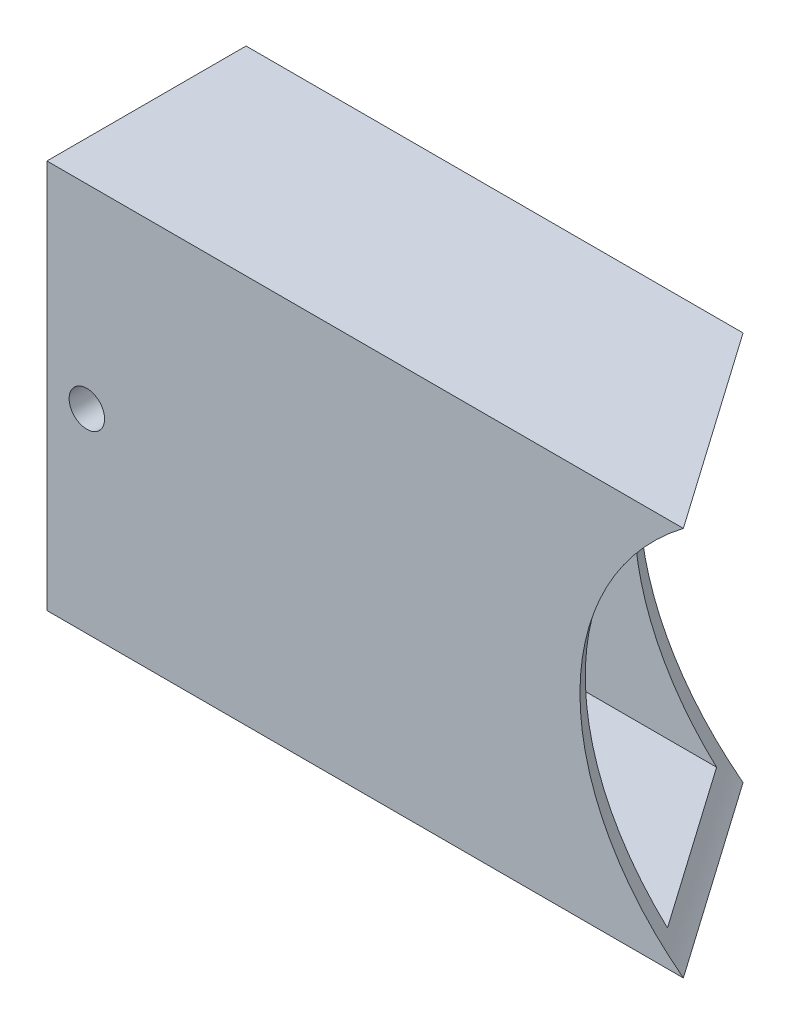
ISO-10303-21;
HEADER;
FILE_DESCRIPTION(('STEP AP214'),'2;1');
FILE_NAME('part.step','',(''),(''),'','','');
FILE_SCHEMA(('AUTOMOTIVE_DESIGN { 1 0 10303 214 1 1 1 1 }'));
ENDSEC;
DATA;
#1=APPLICATION_CONTEXT('core data for automotive mechanical design processes');
#2=APPLICATION_PROTOCOL_DEFINITION('international standard','automotive_design',2000,#1);
#3=PRODUCT_CONTEXT('',#1,'mechanical');
#4=PRODUCT('Part','Part','',(#3));
#5=PRODUCT_RELATED_PRODUCT_CATEGORY('part','',(#4));
#6=PRODUCT_DEFINITION_FORMATION('','',#4);
#7=PRODUCT_DEFINITION_CONTEXT('part definition',#1,'design');
#8=PRODUCT_DEFINITION('design','',#6,#7);
#9=PRODUCT_DEFINITION_SHAPE('','',#8);
#10=(LENGTH_UNIT() NAMED_UNIT(*) SI_UNIT(.MILLI.,.METRE.));
#11=(NAMED_UNIT(*) PLANE_ANGLE_UNIT() SI_UNIT($,.RADIAN.));
#12=(NAMED_UNIT(*) SI_UNIT($,.STERADIAN.) SOLID_ANGLE_UNIT());
#13=UNCERTAINTY_MEASURE_WITH_UNIT(LENGTH_MEASURE(1.E-05),#10,'distance_accuracy_value','');
#14=(GEOMETRIC_REPRESENTATION_CONTEXT(3) GLOBAL_UNCERTAINTY_ASSIGNED_CONTEXT((#13)) GLOBAL_UNIT_ASSIGNED_CONTEXT((#10,
#11,#12)) REPRESENTATION_CONTEXT('',''));
#15=CARTESIAN_POINT('',(0.,0.,0.));
#16=DIRECTION('',(0.,0.,1.));
#17=DIRECTION('',(1.,0.,0.));
#18=AXIS2_PLACEMENT_3D('',#15,#16,#17);
#19=CARTESIAN_POINT('',(-27.,40.2743309975562,0.638657409584718));
#20=DIRECTION('',(0.,1.,0.));
#21=DIRECTION('',(0.,0.,1.));
#22=AXIS2_PLACEMENT_3D('',#19,#20,#21);
#23=PLANE('',#22);
#24=DIRECTION('',(0.573576436351041,0.,0.819152044288995));
#25=VECTOR('',#24,1.);
#26=CARTESIAN_POINT('',(63.1023728158104,40.2743309975562,26.8401633076312));
#27=LINE('',#26,#25);
#28=CARTESIAN_POINT('',(29.0362216407446,40.2743309975562,-21.8113425904153));
#29=VERTEX_POINT('',#28);
#30=CARTESIAN_POINT('',(44.7558808735523,40.2743309975562,0.638657409584718));
#31=VERTEX_POINT('',#30);
#32=EDGE_CURVE('E55',#29,#31,#27,.T.);
#33=ORIENTED_EDGE('',*,*,#32,.F.);
#34=DIRECTION('',(1.,0.,0.));
#35=VECTOR('',#34,1.);
#36=CARTESIAN_POINT('',(-27.,40.2743309975562,-21.8113425904153));
#37=LINE('',#36,#35);
#38=CARTESIAN_POINT('',(-27.,40.2743309975562,-21.8113425904153));
#39=VERTEX_POINT('',#38);
#40=EDGE_CURVE('E210',#39,#29,#37,.T.);
#41=ORIENTED_EDGE('',*,*,#40,.F.);
#42=DIRECTION('',(0.,0.,1.));
#43=VECTOR('',#42,1.);
#44=CARTESIAN_POINT('',(-27.,40.2743309975562,0.638657409584718));
#45=LINE('',#44,#43);
#46=CARTESIAN_POINT('',(-27.,40.2743309975562,0.638657409584718));
#47=VERTEX_POINT('',#46);
#48=EDGE_CURVE('E190',#39,#47,#45,.T.);
#49=ORIENTED_EDGE('',*,*,#48,.T.);
#50=DIRECTION('',(1.,0.,0.));
#51=VECTOR('',#50,1.);
#52=CARTESIAN_POINT('',(-27.,40.2743309975562,0.638657409584718));
#53=LINE('',#52,#51);
#54=EDGE_CURVE('E209',#47,#31,#53,.T.);
#55=ORIENTED_EDGE('',*,*,#54,.T.);
#56=EDGE_LOOP('',(#33,#41,#49,#55));
#57=FACE_BOUND('',#56,.T.);
#58=ADVANCED_FACE('F33',(#57),#23,.T.);
#59=CARTESIAN_POINT('',(-27.,40.2743309975562,-21.8113425904153));
#60=DIRECTION('',(0.,0.,-1.));
#61=DIRECTION('',(-1.,0.,0.));
#62=AXIS2_PLACEMENT_3D('',#59,#60,#61);
#63=PLANE('',#62);
#64=CARTESIAN_POINT('',(54.0009127415229,18.3243309975562,-21.8113425904153));
#65=DIRECTION('',(0.,0.,-1.));
#66=DIRECTION('',(1.,0.,0.));
#67=AXIS2_PLACEMENT_3D('',#64,#65,#66);
#68=ELLIPSE('',#67,36.6232376628435,30.);
#69=CARTESIAN_POINT('',(29.0362216407446,-3.62566900244382,-21.8113425904153));
#70=VERTEX_POINT('',#69);
#71=EDGE_CURVE('E171',#70,#29,#68,.T.);
#72=ORIENTED_EDGE('',*,*,#71,.F.);
#73=DIRECTION('',(1.,0.,0.));
#74=VECTOR('',#73,1.);
#75=CARTESIAN_POINT('',(-27.,-3.62566900244382,-21.8113425904153));
#76=LINE('',#75,#74);
#77=CARTESIAN_POINT('',(-27.,-3.62566900244382,-21.8113425904153));
#78=VERTEX_POINT('',#77);
#79=EDGE_CURVE('E214',#78,#70,#76,.T.);
#80=ORIENTED_EDGE('',*,*,#79,.F.);
#81=DIRECTION('',(0.,1.,0.));
#82=VECTOR('',#81,1.);
#83=CARTESIAN_POINT('',(-27.,40.2743309975562,-21.8113425904153));
#84=LINE('',#83,#82);
#85=EDGE_CURVE('E206',#78,#39,#84,.T.);
#86=ORIENTED_EDGE('',*,*,#85,.T.);
#87=ORIENTED_EDGE('',*,*,#40,.T.);
#88=EDGE_LOOP('',(#72,#80,#86,#87));
#89=FACE_BOUND('',#88,.T.);
#90=ADVANCED_FACE('F244',(#89),#63,.T.);
#91=CARTESIAN_POINT('',(-27.,-3.62566900244382,0.638657409584711));
#92=DIRECTION('',(0.,-1.,0.));
#93=DIRECTION('',(0.,0.,-1.));
#94=AXIS2_PLACEMENT_3D('',#91,#92,#93);
#95=PLANE('',#94);
#96=DIRECTION('',(0.573576436351041,0.,0.819152044288995));
#97=VECTOR('',#96,1.);
#98=CARTESIAN_POINT('',(63.1023728158104,-3.62566900244382,26.8401633076313));
#99=LINE('',#98,#97);
#100=CARTESIAN_POINT('',(44.7558808735523,-3.62566900244382,0.638657409584711));
#101=VERTEX_POINT('',#100);
#102=EDGE_CURVE('E169',#101,#70,#99,.F.);
#103=ORIENTED_EDGE('',*,*,#102,.F.);
#104=DIRECTION('',(1.,0.,0.));
#105=VECTOR('',#104,1.);
#106=CARTESIAN_POINT('',(-27.,-3.62566900244382,0.638657409584711));
#107=LINE('',#106,#105);
#108=CARTESIAN_POINT('',(-27.,-3.62566900244382,0.638657409584711));
#109=VERTEX_POINT('',#108);
#110=EDGE_CURVE('E217',#109,#101,#107,.T.);
#111=ORIENTED_EDGE('',*,*,#110,.F.);
#112=DIRECTION('',(0.,0.,-1.));
#113=VECTOR('',#112,1.);
#114=CARTESIAN_POINT('',(-27.,-3.62566900244382,0.638657409584711));
#115=LINE('',#114,#113);
#116=EDGE_CURVE('E203',#109,#78,#115,.T.);
#117=ORIENTED_EDGE('',*,*,#116,.T.);
#118=ORIENTED_EDGE('',*,*,#79,.T.);
#119=EDGE_LOOP('',(#103,#111,#117,#118));
#120=FACE_BOUND('',#119,.T.);
#121=ADVANCED_FACE('F249',(#120),#95,.T.);
#122=CARTESIAN_POINT('',(-27.,40.2743309975562,0.638657409584718));
#123=DIRECTION('',(0.,0.,1.));
#124=DIRECTION('',(0.,-1.,0.));
#125=AXIS2_PLACEMENT_3D('',#122,#123,#124);
#126=PLANE('',#125);
#127=CARTESIAN_POINT('',(-22.5,18.3243309975562,0.638657409584711));
#128=DIRECTION('',(0.,0.,1.));
#129=DIRECTION('',(1.,0.,0.));
#130=AXIS2_PLACEMENT_3D('',#127,#128,#129);
#131=CIRCLE('',#130,2.);
#132=CARTESIAN_POINT('',(-20.5,18.3243309975562,0.638657409584711));
#133=VERTEX_POINT('',#132);
#134=EDGE_CURVE('E147',#133,#133,#131,.T.);
#135=ORIENTED_EDGE('',*,*,#134,.F.);
#136=EDGE_LOOP('',(#135));
#137=FACE_BOUND('',#136,.T.);
#138=DIRECTION('',(0.,-1.,0.));
#139=VECTOR('',#138,1.);
#140=CARTESIAN_POINT('',(-27.,40.2743309975562,0.638657409584718));
#141=LINE('',#140,#139);
#142=EDGE_CURVE('E201',#47,#109,#141,.T.);
#143=ORIENTED_EDGE('',*,*,#142,.T.);
#144=ORIENTED_EDGE('',*,*,#110,.T.);
#145=CARTESIAN_POINT('',(69.7205719743306,18.3243309975562,0.638657409584714));
#146=DIRECTION('',(0.,0.,1.));
#147=DIRECTION('',(1.,0.,0.));
#148=AXIS2_PLACEMENT_3D('',#145,#146,#147);
#149=ELLIPSE('',#148,36.6232376628435,30.);
#150=EDGE_CURVE('E167',#31,#101,#149,.T.);
#151=ORIENTED_EDGE('',*,*,#150,.F.);
#152=ORIENTED_EDGE('',*,*,#54,.F.);
#153=EDGE_LOOP('',(#143,#144,#151,#152));
#154=FACE_BOUND('',#153,.T.);
#155=ADVANCED_FACE('F259',(#137,#154),#126,.T.);
#156=CARTESIAN_POINT('',(-27.,0.,0.));
#157=DIRECTION('',(-1.,0.,0.));
#158=DIRECTION('',(0.,0.,1.));
#159=AXIS2_PLACEMENT_3D('',#156,#157,#158);
#160=PLANE('',#159);
#161=DIRECTION('',(0.,-1.,0.));
#162=VECTOR('',#161,1.);
#163=CARTESIAN_POINT('',(-27.,38.2743309975562,-1.36134259041528));
#164=LINE('',#163,#162);
#165=CARTESIAN_POINT('',(-27.,38.2743309975562,-1.36134259041528));
#166=VERTEX_POINT('',#165);
#167=CARTESIAN_POINT('',(-27.,22.8532950162725,-1.36134259041528));
#168=VERTEX_POINT('',#167);
#169=EDGE_CURVE('E175',#166,#168,#164,.T.);
#170=ORIENTED_EDGE('',*,*,#169,.T.);
#171=DIRECTION('',(0.,0.,1.));
#172=VECTOR('',#171,1.);
#173=CARTESIAN_POINT('',(-27.,22.8532950162725,-5.36134259041529));
#174=LINE('',#173,#172);
#175=CARTESIAN_POINT('',(-27.,22.8532950162725,-5.36134259041529));
#176=VERTEX_POINT('',#175);
#177=EDGE_CURVE('E143',#176,#168,#174,.T.);
#178=ORIENTED_EDGE('',*,*,#177,.F.);
#179=DIRECTION('',(0.,-1.,0.));
#180=VECTOR('',#179,1.);
#181=CARTESIAN_POINT('',(-27.,22.8532950162725,-5.36134259041529));
#182=LINE('',#181,#180);
#183=CARTESIAN_POINT('',(-27.,13.7953669788399,-5.36134259041529));
#184=VERTEX_POINT('',#183);
#185=EDGE_CURVE('E135',#176,#184,#182,.T.);
#186=ORIENTED_EDGE('',*,*,#185,.T.);
#187=DIRECTION('',(0.,0.,1.));
#188=VECTOR('',#187,1.);
#189=CARTESIAN_POINT('',(-27.,13.7953669788399,-5.36134259041529));
#190=LINE('',#189,#188);
#191=CARTESIAN_POINT('',(-27.,13.7953669788399,-1.36134259041529));
#192=VERTEX_POINT('',#191);
#193=EDGE_CURVE('E119',#184,#192,#190,.T.);
#194=ORIENTED_EDGE('',*,*,#193,.T.);
#195=CARTESIAN_POINT('',(-27.,-1.62566900244382,-1.36134259041529));
#196=VERTEX_POINT('',#195);
#197=EDGE_CURVE('E174',#192,#196,#164,.T.);
#198=ORIENTED_EDGE('',*,*,#197,.T.);
#199=DIRECTION('',(0.,0.,-1.));
#200=VECTOR('',#199,1.);
#201=CARTESIAN_POINT('',(-27.,-1.62566900244382,-1.36134259041529));
#202=LINE('',#201,#200);
#203=CARTESIAN_POINT('',(-27.,-1.62566900244382,-19.8113425904153));
#204=VERTEX_POINT('',#203);
#205=EDGE_CURVE('E177',#196,#204,#202,.T.);
#206=ORIENTED_EDGE('',*,*,#205,.T.);
#207=DIRECTION('',(0.,1.,0.));
#208=VECTOR('',#207,1.);
#209=CARTESIAN_POINT('',(-27.,38.2743309975562,-19.8113425904153));
#210=LINE('',#209,#208);
#211=CARTESIAN_POINT('',(-27.,38.2743309975562,-19.8113425904153));
#212=VERTEX_POINT('',#211);
#213=EDGE_CURVE('E180',#204,#212,#210,.T.);
#214=ORIENTED_EDGE('',*,*,#213,.T.);
#215=DIRECTION('',(0.,0.,1.));
#216=VECTOR('',#215,1.);
#217=CARTESIAN_POINT('',(-27.,38.2743309975562,-1.36134259041528));
#218=LINE('',#217,#216);
#219=EDGE_CURVE('E183',#212,#166,#218,.T.);
#220=ORIENTED_EDGE('',*,*,#219,.T.);
#221=EDGE_LOOP('',(#170,#178,#186,#194,#198,#206,#214,#220));
#222=FACE_BOUND('',#221,.T.);
#223=ORIENTED_EDGE('',*,*,#116,.F.);
#224=ORIENTED_EDGE('',*,*,#142,.F.);
#225=ORIENTED_EDGE('',*,*,#48,.F.);
#226=ORIENTED_EDGE('',*,*,#85,.F.);
#227=EDGE_LOOP('',(#223,#224,#225,#226));
#228=FACE_BOUND('',#227,.T.);
#229=ADVANCED_FACE('F141',(#222,#228),#160,.T.);
#230=CARTESIAN_POINT('',(-27.,38.2743309975562,-1.36134259041528));
#231=DIRECTION('',(0.,0.,1.));
#232=DIRECTION('',(0.,-1.,0.));
#233=AXIS2_PLACEMENT_3D('',#230,#231,#232);
#234=PLANE('',#233);
#235=DIRECTION('',(0.,1.,0.));
#236=VECTOR('',#235,1.);
#237=CARTESIAN_POINT('',(-17.3022461673715,38.2743309975562,-1.36134259041528));
#238=LINE('',#237,#236);
#239=CARTESIAN_POINT('',(-17.3022461673715,13.7953669788399,-1.36134259041529));
#240=VERTEX_POINT('',#239);
#241=CARTESIAN_POINT('',(-17.3022461673715,22.8532950162725,-1.36134259041529));
#242=VERTEX_POINT('',#241);
#243=EDGE_CURVE('E40',#240,#242,#238,.T.);
#244=ORIENTED_EDGE('',*,*,#243,.T.);
#245=DIRECTION('',(-1.,0.,0.));
#246=VECTOR('',#245,1.);
#247=CARTESIAN_POINT('',(-27.,22.8532950162725,-1.36134259041529));
#248=LINE('',#247,#246);
#249=EDGE_CURVE('E11',#242,#168,#248,.T.);
#250=ORIENTED_EDGE('',*,*,#249,.T.);
#251=ORIENTED_EDGE('',*,*,#169,.F.);
#252=DIRECTION('',(1.,0.,0.));
#253=VECTOR('',#252,1.);
#254=CARTESIAN_POINT('',(-27.,38.2743309975562,-1.36134259041528));
#255=LINE('',#254,#253);
#256=CARTESIAN_POINT('',(40.9683351350106,38.2743309975562,-1.36134259041528));
#257=VERTEX_POINT('',#256);
#258=EDGE_CURVE('E187',#166,#257,#255,.T.);
#259=ORIENTED_EDGE('',*,*,#258,.T.);
#260=CARTESIAN_POINT('',(68.3201568979112,18.3243309975562,-1.36134259041529));
#261=DIRECTION('',(0.,0.,1.));
#262=DIRECTION('',(1.,0.,0.));
#263=AXIS2_PLACEMENT_3D('',#260,#261,#262);
#264=ELLIPSE('',#263,36.6232376628435,30.);
#265=CARTESIAN_POINT('',(40.9683351350106,-1.62566900244382,-1.36134259041528));
#266=VERTEX_POINT('',#265);
#267=EDGE_CURVE('E164',#257,#266,#264,.T.);
#268=ORIENTED_EDGE('',*,*,#267,.T.);
#269=DIRECTION('',(1.,0.,0.));
#270=VECTOR('',#269,1.);
#271=CARTESIAN_POINT('',(-27.,-1.62566900244382,-1.36134259041529));
#272=LINE('',#271,#270);
#273=EDGE_CURVE('E186',#196,#266,#272,.T.);
#274=ORIENTED_EDGE('',*,*,#273,.F.);
#275=ORIENTED_EDGE('',*,*,#197,.F.);
#276=DIRECTION('',(1.,0.,0.));
#277=VECTOR('',#276,1.);
#278=CARTESIAN_POINT('',(-27.,13.7953669788399,-1.36134259041529));
#279=LINE('',#278,#277);
#280=EDGE_CURVE('E124',#192,#240,#279,.T.);
#281=ORIENTED_EDGE('',*,*,#280,.T.);
#282=EDGE_LOOP('',(#244,#250,#251,#259,#268,#274,#275,#281));
#283=FACE_BOUND('',#282,.T.);
#284=ADVANCED_FACE('F226',(#283),#234,.F.);
#285=CARTESIAN_POINT('',(-27.,38.2743309975562,-1.36134259041528));
#286=DIRECTION('',(0.,1.,0.));
#287=DIRECTION('',(0.,0.,1.));
#288=AXIS2_PLACEMENT_3D('',#285,#286,#287);
#289=PLANE('',#288);
#290=DIRECTION('',(1.,0.,0.));
#291=VECTOR('',#290,1.);
#292=CARTESIAN_POINT('',(-27.,38.2743309975562,-19.8113425904153));
#293=LINE('',#292,#291);
#294=CARTESIAN_POINT('',(28.0495060550417,38.2743309975562,-19.8113425904153));
#295=VERTEX_POINT('',#294);
#296=EDGE_CURVE('E191',#212,#295,#293,.T.);
#297=ORIENTED_EDGE('',*,*,#296,.T.);
#298=DIRECTION('',(0.573576436351041,0.,0.819152044288995));
#299=VECTOR('',#298,1.);
#300=CARTESIAN_POINT('',(61.5005840991512,38.2743309975562,27.9617478416553));
#301=LINE('',#300,#299);
#302=EDGE_CURVE('E161',#295,#257,#301,.T.);
#303=ORIENTED_EDGE('',*,*,#302,.T.);
#304=ORIENTED_EDGE('',*,*,#258,.F.);
#305=ORIENTED_EDGE('',*,*,#219,.F.);
#306=EDGE_LOOP('',(#297,#303,#304,#305));
#307=FACE_BOUND('',#306,.T.);
#308=ADVANCED_FACE('F268',(#307),#289,.F.);
#309=CARTESIAN_POINT('',(-27.,38.2743309975562,-19.8113425904153));
#310=DIRECTION('',(0.,0.,-1.));
#311=DIRECTION('',(-1.,0.,0.));
#312=AXIS2_PLACEMENT_3D('',#309,#310,#311);
#313=PLANE('',#312);
#314=DIRECTION('',(1.,0.,0.));
#315=VECTOR('',#314,1.);
#316=CARTESIAN_POINT('',(-27.,-1.62566900244382,-19.8113425904153));
#317=LINE('',#316,#315);
#318=CARTESIAN_POINT('',(28.0495060550416,-1.62566900244382,-19.8113425904153));
#319=VERTEX_POINT('',#318);
#320=EDGE_CURVE('E194',#204,#319,#317,.T.);
#321=ORIENTED_EDGE('',*,*,#320,.T.);
#322=CARTESIAN_POINT('',(55.4013278179423,18.3243309975562,-19.8113425904153));
#323=DIRECTION('',(0.,0.,-1.));
#324=DIRECTION('',(1.,0.,0.));
#325=AXIS2_PLACEMENT_3D('',#322,#323,#324);
#326=ELLIPSE('',#325,36.6232376628435,30.);
#327=EDGE_CURVE('E154',#319,#295,#326,.T.);
#328=ORIENTED_EDGE('',*,*,#327,.T.);
#329=ORIENTED_EDGE('',*,*,#296,.F.);
#330=ORIENTED_EDGE('',*,*,#213,.F.);
#331=EDGE_LOOP('',(#321,#328,#329,#330));
#332=FACE_BOUND('',#331,.T.);
#333=ADVANCED_FACE('F265',(#332),#313,.F.);
#334=CARTESIAN_POINT('',(-27.,-1.62566900244382,-1.36134259041529));
#335=DIRECTION('',(0.,-1.,0.));
#336=DIRECTION('',(0.,0.,-1.));
#337=AXIS2_PLACEMENT_3D('',#334,#335,#336);
#338=PLANE('',#337);
#339=ORIENTED_EDGE('',*,*,#273,.T.);
#340=DIRECTION('',(0.573576436351041,0.,0.819152044288995));
#341=VECTOR('',#340,1.);
#342=CARTESIAN_POINT('',(61.5005840991512,-1.62566900244382,27.9617478416553));
#343=LINE('',#342,#341);
#344=EDGE_CURVE('E213',#266,#319,#343,.F.);
#345=ORIENTED_EDGE('',*,*,#344,.T.);
#346=ORIENTED_EDGE('',*,*,#320,.F.);
#347=ORIENTED_EDGE('',*,*,#205,.F.);
#348=EDGE_LOOP('',(#339,#345,#346,#347));
#349=FACE_BOUND('',#348,.T.);
#350=ADVANCED_FACE('F240',(#349),#338,.F.);
#351=CARTESIAN_POINT('',(79.8539319803844,18.3243309975562,15.1105953038308));
#352=DIRECTION('',(0.573576436351041,0.,0.819152044288995));
#353=DIRECTION('',(0.819152044288995,0.,-0.573576436351041));
#354=AXIS2_PLACEMENT_3D('',#351,#352,#353);
#355=CYLINDRICAL_SURFACE('',#354,30.);
#356=ORIENTED_EDGE('',*,*,#32,.T.);
#357=ORIENTED_EDGE('',*,*,#150,.T.);
#358=ORIENTED_EDGE('',*,*,#102,.T.);
#359=ORIENTED_EDGE('',*,*,#71,.T.);
#360=EDGE_LOOP('',(#356,#357,#358,#359));
#361=FACE_BOUND('',#360,.T.);
#362=ORIENTED_EDGE('',*,*,#302,.F.);
#363=ORIENTED_EDGE('',*,*,#327,.F.);
#364=ORIENTED_EDGE('',*,*,#344,.F.);
#365=ORIENTED_EDGE('',*,*,#267,.F.);
#366=EDGE_LOOP('',(#362,#363,#364,#365));
#367=FACE_BOUND('',#366,.T.);
#368=ADVANCED_FACE('F233',(#361,#367),#355,.F.);
#369=CARTESIAN_POINT('',(-27.,22.8532950162725,-5.36134259041529));
#370=DIRECTION('',(0.,1.,0.));
#371=DIRECTION('',(0.,0.,1.));
#372=AXIS2_PLACEMENT_3D('',#369,#370,#371);
#373=PLANE('',#372);
#374=ORIENTED_EDGE('',*,*,#249,.F.);
#375=DIRECTION('',(0.,0.,1.));
#376=VECTOR('',#375,1.);
#377=CARTESIAN_POINT('',(-17.3022461673715,22.8532950162725,-5.36134259041529));
#378=LINE('',#377,#376);
#379=CARTESIAN_POINT('',(-17.3022461673715,22.8532950162725,-5.36134259041529));
#380=VERTEX_POINT('',#379);
#381=EDGE_CURVE('E155',#380,#242,#378,.T.);
#382=ORIENTED_EDGE('',*,*,#381,.F.);
#383=DIRECTION('',(-1.,0.,0.));
#384=VECTOR('',#383,1.);
#385=CARTESIAN_POINT('',(-27.,22.8532950162725,-5.36134259041529));
#386=LINE('',#385,#384);
#387=EDGE_CURVE('E128',#380,#176,#386,.T.);
#388=ORIENTED_EDGE('',*,*,#387,.T.);
#389=ORIENTED_EDGE('',*,*,#177,.T.);
#390=EDGE_LOOP('',(#374,#382,#388,#389));
#391=FACE_BOUND('',#390,.T.);
#392=ADVANCED_FACE('F231',(#391),#373,.T.);
#393=CARTESIAN_POINT('',(-17.3022461673715,22.8532950162725,-5.36134259041529));
#394=DIRECTION('',(1.,0.,0.));
#395=DIRECTION('',(0.,0.,-1.));
#396=AXIS2_PLACEMENT_3D('',#393,#394,#395);
#397=PLANE('',#396);
#398=ORIENTED_EDGE('',*,*,#243,.F.);
#399=DIRECTION('',(0.,0.,1.));
#400=VECTOR('',#399,1.);
#401=CARTESIAN_POINT('',(-17.3022461673715,13.7953669788399,-5.36134259041529));
#402=LINE('',#401,#400);
#403=CARTESIAN_POINT('',(-17.3022461673715,13.7953669788399,-5.36134259041529));
#404=VERTEX_POINT('',#403);
#405=EDGE_CURVE('E47',#404,#240,#402,.T.);
#406=ORIENTED_EDGE('',*,*,#405,.F.);
#407=DIRECTION('',(0.,1.,0.));
#408=VECTOR('',#407,1.);
#409=CARTESIAN_POINT('',(-17.3022461673715,22.8532950162725,-5.36134259041529));
#410=LINE('',#409,#408);
#411=EDGE_CURVE('E138',#404,#380,#410,.T.);
#412=ORIENTED_EDGE('',*,*,#411,.T.);
#413=ORIENTED_EDGE('',*,*,#381,.T.);
#414=EDGE_LOOP('',(#398,#406,#412,#413));
#415=FACE_BOUND('',#414,.T.);
#416=ADVANCED_FACE('F229',(#415),#397,.T.);
#417=CARTESIAN_POINT('',(-27.,13.7953669788399,-5.36134259041529));
#418=DIRECTION('',(0.,-1.,0.));
#419=DIRECTION('',(0.,0.,-1.));
#420=AXIS2_PLACEMENT_3D('',#417,#418,#419);
#421=PLANE('',#420);
#422=ORIENTED_EDGE('',*,*,#280,.F.);
#423=ORIENTED_EDGE('',*,*,#193,.F.);
#424=DIRECTION('',(1.,0.,0.));
#425=VECTOR('',#424,1.);
#426=CARTESIAN_POINT('',(-27.,13.7953669788399,-5.36134259041529));
#427=LINE('',#426,#425);
#428=EDGE_CURVE('E122',#184,#404,#427,.T.);
#429=ORIENTED_EDGE('',*,*,#428,.T.);
#430=ORIENTED_EDGE('',*,*,#405,.T.);
#431=EDGE_LOOP('',(#422,#423,#429,#430));
#432=FACE_BOUND('',#431,.T.);
#433=ADVANCED_FACE('F121',(#432),#421,.T.);
#434=CARTESIAN_POINT('',(-22.5,18.3243309975562,-5.36134259041529));
#435=DIRECTION('',(0.,0.,1.));
#436=DIRECTION('',(1.,0.,0.));
#437=AXIS2_PLACEMENT_3D('',#434,#435,#436);
#438=CYLINDRICAL_SURFACE('',#437,2.);
#439=CARTESIAN_POINT('',(-22.5,18.3243309975562,-5.36134259041529));
#440=DIRECTION('',(0.,0.,1.));
#441=DIRECTION('',(1.,0.,0.));
#442=AXIS2_PLACEMENT_3D('',#439,#440,#441);
#443=CIRCLE('',#442,2.);
#444=CARTESIAN_POINT('',(-20.5,18.3243309975562,-5.36134259041529));
#445=VERTEX_POINT('',#444);
#446=EDGE_CURVE('E144',#445,#445,#443,.T.);
#447=ORIENTED_EDGE('',*,*,#446,.F.);
#448=EDGE_LOOP('',(#447));
#449=FACE_BOUND('',#448,.T.);
#450=ORIENTED_EDGE('',*,*,#134,.T.);
#451=EDGE_LOOP('',(#450));
#452=FACE_BOUND('',#451,.T.);
#453=ADVANCED_FACE('F292',(#449,#452),#438,.F.);
#454=CARTESIAN_POINT('',(0.,0.,-5.36134259041529));
#455=DIRECTION('',(0.,0.,1.));
#456=DIRECTION('',(1.,0.,0.));
#457=AXIS2_PLACEMENT_3D('',#454,#455,#456);
#458=PLANE('',#457);
#459=ORIENTED_EDGE('',*,*,#446,.T.);
#460=EDGE_LOOP('',(#459));
#461=FACE_BOUND('',#460,.T.);
#462=ORIENTED_EDGE('',*,*,#185,.F.);
#463=ORIENTED_EDGE('',*,*,#387,.F.);
#464=ORIENTED_EDGE('',*,*,#411,.F.);
#465=ORIENTED_EDGE('',*,*,#428,.F.);
#466=EDGE_LOOP('',(#462,#463,#464,#465));
#467=FACE_BOUND('',#466,.T.);
#468=ADVANCED_FACE('F133',(#461,#467),#458,.F.);
#469=CLOSED_SHELL('',(#58,#90,#121,#155,#229,#284,#308,#333,#350,#368,#392,#416,#433,#453,#468));
#470=MANIFOLD_SOLID_BREP('B2',#469);
#471=ADVANCED_BREP_SHAPE_REPRESENTATION('',(#18,#470),#14);
#472=SHAPE_DEFINITION_REPRESENTATION(#9,#471);
ENDSEC;
END-ISO-10303-21;
